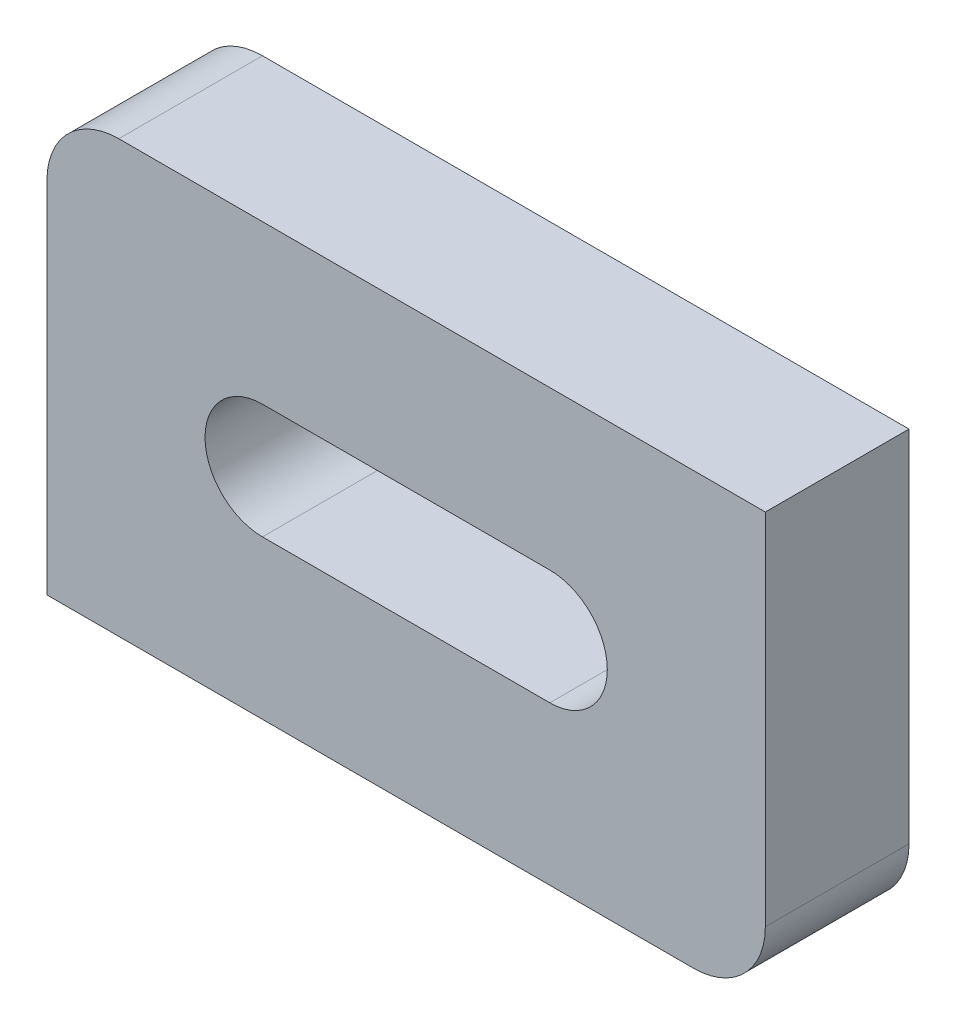
ISO-10303-21;
HEADER;
FILE_DESCRIPTION(('STEP AP214'),'2;1');
FILE_NAME('part.step','',(''),(''),'','','');
FILE_SCHEMA(('AUTOMOTIVE_DESIGN { 1 0 10303 214 1 1 1 1 }'));
ENDSEC;
DATA;
#1=APPLICATION_CONTEXT('core data for automotive mechanical design processes');
#2=APPLICATION_PROTOCOL_DEFINITION('international standard','automotive_design',2000,#1);
#3=PRODUCT_CONTEXT('',#1,'mechanical');
#4=PRODUCT('Part','Part','',(#3));
#5=PRODUCT_RELATED_PRODUCT_CATEGORY('part','',(#4));
#6=PRODUCT_DEFINITION_FORMATION('','',#4);
#7=PRODUCT_DEFINITION_CONTEXT('part definition',#1,'design');
#8=PRODUCT_DEFINITION('design','',#6,#7);
#9=PRODUCT_DEFINITION_SHAPE('','',#8);
#10=(LENGTH_UNIT() NAMED_UNIT(*) SI_UNIT(.MILLI.,.METRE.));
#11=(NAMED_UNIT(*) PLANE_ANGLE_UNIT() SI_UNIT($,.RADIAN.));
#12=(NAMED_UNIT(*) SI_UNIT($,.STERADIAN.) SOLID_ANGLE_UNIT());
#13=UNCERTAINTY_MEASURE_WITH_UNIT(LENGTH_MEASURE(1.E-05),#10,'distance_accuracy_value','');
#14=(GEOMETRIC_REPRESENTATION_CONTEXT(3) GLOBAL_UNCERTAINTY_ASSIGNED_CONTEXT((#13)) GLOBAL_UNIT_ASSIGNED_CONTEXT((#10,
#11,#12)) REPRESENTATION_CONTEXT('',''));
#15=CARTESIAN_POINT('',(0.,0.,0.));
#16=DIRECTION('',(0.,0.,1.));
#17=DIRECTION('',(1.,0.,0.));
#18=AXIS2_PLACEMENT_3D('',#15,#16,#17);
#19=CARTESIAN_POINT('',(45.,5.,10.));
#20=DIRECTION('',(0.,0.,-1.));
#21=DIRECTION('',(-1.,0.,0.));
#22=AXIS2_PLACEMENT_3D('',#19,#20,#21);
#23=PLANE('',#22);
#24=DIRECTION('',(0.,-1.,0.));
#25=VECTOR('',#24,1.);
#26=CARTESIAN_POINT('',(0.,25.,10.));
#27=LINE('',#26,#25);
#28=CARTESIAN_POINT('',(0.,25.,10.));
#29=VERTEX_POINT('',#28);
#30=CARTESIAN_POINT('',(0.,0.,10.));
#31=VERTEX_POINT('',#30);
#32=EDGE_CURVE('E148',#29,#31,#27,.T.);
#33=ORIENTED_EDGE('',*,*,#32,.T.);
#34=DIRECTION('',(1.,0.,0.));
#35=VECTOR('',#34,1.);
#36=CARTESIAN_POINT('',(0.,0.,10.));
#37=LINE('',#36,#35);
#38=CARTESIAN_POINT('',(45.,0.,10.));
#39=VERTEX_POINT('',#38);
#40=EDGE_CURVE('E151',#31,#39,#37,.T.);
#41=ORIENTED_EDGE('',*,*,#40,.T.);
#42=CARTESIAN_POINT('',(45.,5.,10.));
#43=DIRECTION('',(0.,0.,1.));
#44=DIRECTION('',(-1.,0.,0.));
#45=AXIS2_PLACEMENT_3D('',#42,#43,#44);
#46=CIRCLE('',#45,5.);
#47=CARTESIAN_POINT('',(50.,5.00000000000004,10.));
#48=VERTEX_POINT('',#47);
#49=EDGE_CURVE('E154',#39,#48,#46,.T.);
#50=ORIENTED_EDGE('',*,*,#49,.T.);
#51=DIRECTION('',(0.,1.,0.));
#52=VECTOR('',#51,1.);
#53=CARTESIAN_POINT('',(50.,5.00000000000004,10.));
#54=LINE('',#53,#52);
#55=CARTESIAN_POINT('',(50.,30.,10.));
#56=VERTEX_POINT('',#55);
#57=EDGE_CURVE('E156',#48,#56,#54,.T.);
#58=ORIENTED_EDGE('',*,*,#57,.T.);
#59=DIRECTION('',(-1.,0.,0.));
#60=VECTOR('',#59,1.);
#61=CARTESIAN_POINT('',(50.,30.,10.));
#62=LINE('',#61,#60);
#63=CARTESIAN_POINT('',(5.00000000000004,30.,10.));
#64=VERTEX_POINT('',#63);
#65=EDGE_CURVE('E158',#56,#64,#62,.T.);
#66=ORIENTED_EDGE('',*,*,#65,.T.);
#67=CARTESIAN_POINT('',(5.,25.,10.));
#68=DIRECTION('',(0.,0.,1.));
#69=DIRECTION('',(-1.,0.,0.));
#70=AXIS2_PLACEMENT_3D('',#67,#68,#69);
#71=CIRCLE('',#70,5.);
#72=EDGE_CURVE('E160',#64,#29,#71,.T.);
#73=ORIENTED_EDGE('',*,*,#72,.T.);
#74=EDGE_LOOP('',(#33,#41,#50,#58,#66,#73));
#75=FACE_BOUND('',#74,.T.);
#76=CARTESIAN_POINT('',(15.,15.,10.));
#77=DIRECTION('',(0.,0.,1.));
#78=DIRECTION('',(1.,0.,0.));
#79=AXIS2_PLACEMENT_3D('',#76,#77,#78);
#80=CIRCLE('',#79,4.);
#81=CARTESIAN_POINT('',(15.,19.,10.));
#82=VERTEX_POINT('',#81);
#83=CARTESIAN_POINT('',(15.,11.,10.));
#84=VERTEX_POINT('',#83);
#85=EDGE_CURVE('E112',#82,#84,#80,.T.);
#86=ORIENTED_EDGE('',*,*,#85,.F.);
#87=DIRECTION('',(-1.,0.,0.));
#88=VECTOR('',#87,1.);
#89=CARTESIAN_POINT('',(15.,19.,10.));
#90=LINE('',#89,#88);
#91=CARTESIAN_POINT('',(35.,19.,10.));
#92=VERTEX_POINT('',#91);
#93=EDGE_CURVE('E134',#92,#82,#90,.T.);
#94=ORIENTED_EDGE('',*,*,#93,.F.);
#95=CARTESIAN_POINT('',(35.,15.,10.));
#96=DIRECTION('',(0.,0.,1.));
#97=DIRECTION('',(1.,0.,0.));
#98=AXIS2_PLACEMENT_3D('',#95,#96,#97);
#99=CIRCLE('',#98,4.);
#100=CARTESIAN_POINT('',(35.,11.,10.));
#101=VERTEX_POINT('',#100);
#102=EDGE_CURVE('E132',#101,#92,#99,.T.);
#103=ORIENTED_EDGE('',*,*,#102,.F.);
#104=DIRECTION('',(1.,0.,0.));
#105=VECTOR('',#104,1.);
#106=CARTESIAN_POINT('',(15.,11.,10.));
#107=LINE('',#106,#105);
#108=EDGE_CURVE('E120',#84,#101,#107,.T.);
#109=ORIENTED_EDGE('',*,*,#108,.F.);
#110=EDGE_LOOP('',(#86,#94,#103,#109));
#111=FACE_BOUND('',#110,.T.);
#112=ADVANCED_FACE('F35',(#75,#111),#23,.F.);
#113=CARTESIAN_POINT('',(45.,5.,0.));
#114=DIRECTION('',(0.,0.,-1.));
#115=DIRECTION('',(-1.,0.,0.));
#116=AXIS2_PLACEMENT_3D('',#113,#114,#115);
#117=PLANE('',#116);
#118=DIRECTION('',(0.,-1.,0.));
#119=VECTOR('',#118,1.);
#120=CARTESIAN_POINT('',(0.,25.,0.));
#121=LINE('',#120,#119);
#122=CARTESIAN_POINT('',(0.,25.,0.));
#123=VERTEX_POINT('',#122);
#124=CARTESIAN_POINT('',(0.,0.,0.));
#125=VERTEX_POINT('',#124);
#126=EDGE_CURVE('E128',#123,#125,#121,.T.);
#127=ORIENTED_EDGE('',*,*,#126,.F.);
#128=CARTESIAN_POINT('',(5.,25.,0.));
#129=DIRECTION('',(0.,0.,1.));
#130=DIRECTION('',(-1.,0.,0.));
#131=AXIS2_PLACEMENT_3D('',#128,#129,#130);
#132=CIRCLE('',#131,5.);
#133=CARTESIAN_POINT('',(5.00000000000004,30.,0.));
#134=VERTEX_POINT('',#133);
#135=EDGE_CURVE('E152',#134,#123,#132,.T.);
#136=ORIENTED_EDGE('',*,*,#135,.F.);
#137=DIRECTION('',(-1.,0.,0.));
#138=VECTOR('',#137,1.);
#139=CARTESIAN_POINT('',(50.,30.,0.));
#140=LINE('',#139,#138);
#141=CARTESIAN_POINT('',(50.,30.,0.));
#142=VERTEX_POINT('',#141);
#143=EDGE_CURVE('E171',#142,#134,#140,.T.);
#144=ORIENTED_EDGE('',*,*,#143,.F.);
#145=DIRECTION('',(0.,1.,0.));
#146=VECTOR('',#145,1.);
#147=CARTESIAN_POINT('',(50.,5.00000000000004,0.));
#148=LINE('',#147,#146);
#149=CARTESIAN_POINT('',(50.,5.00000000000004,0.));
#150=VERTEX_POINT('',#149);
#151=EDGE_CURVE('E169',#150,#142,#148,.T.);
#152=ORIENTED_EDGE('',*,*,#151,.F.);
#153=CARTESIAN_POINT('',(45.,5.,0.));
#154=DIRECTION('',(0.,0.,1.));
#155=DIRECTION('',(-1.,0.,0.));
#156=AXIS2_PLACEMENT_3D('',#153,#154,#155);
#157=CIRCLE('',#156,5.);
#158=CARTESIAN_POINT('',(45.,0.,0.));
#159=VERTEX_POINT('',#158);
#160=EDGE_CURVE('E167',#159,#150,#157,.T.);
#161=ORIENTED_EDGE('',*,*,#160,.F.);
#162=DIRECTION('',(1.,0.,0.));
#163=VECTOR('',#162,1.);
#164=CARTESIAN_POINT('',(0.,0.,0.));
#165=LINE('',#164,#163);
#166=EDGE_CURVE('E165',#125,#159,#165,.T.);
#167=ORIENTED_EDGE('',*,*,#166,.F.);
#168=EDGE_LOOP('',(#127,#136,#144,#152,#161,#167));
#169=FACE_BOUND('',#168,.T.);
#170=DIRECTION('',(-1.,0.,0.));
#171=VECTOR('',#170,1.);
#172=CARTESIAN_POINT('',(15.,19.,0.));
#173=LINE('',#172,#171);
#174=CARTESIAN_POINT('',(35.,19.,0.));
#175=VERTEX_POINT('',#174);
#176=CARTESIAN_POINT('',(15.,19.,0.));
#177=VERTEX_POINT('',#176);
#178=EDGE_CURVE('E121',#175,#177,#173,.T.);
#179=ORIENTED_EDGE('',*,*,#178,.T.);
#180=CARTESIAN_POINT('',(15.,15.,0.));
#181=DIRECTION('',(0.,0.,1.));
#182=DIRECTION('',(1.,0.,0.));
#183=AXIS2_PLACEMENT_3D('',#180,#181,#182);
#184=CIRCLE('',#183,4.);
#185=CARTESIAN_POINT('',(15.,11.,0.));
#186=VERTEX_POINT('',#185);
#187=EDGE_CURVE('E58',#177,#186,#184,.T.);
#188=ORIENTED_EDGE('',*,*,#187,.T.);
#189=DIRECTION('',(1.,0.,0.));
#190=VECTOR('',#189,1.);
#191=CARTESIAN_POINT('',(15.,11.,0.));
#192=LINE('',#191,#190);
#193=CARTESIAN_POINT('',(35.,11.,0.));
#194=VERTEX_POINT('',#193);
#195=EDGE_CURVE('E127',#186,#194,#192,.T.);
#196=ORIENTED_EDGE('',*,*,#195,.T.);
#197=CARTESIAN_POINT('',(35.,15.,0.));
#198=DIRECTION('',(0.,0.,1.));
#199=DIRECTION('',(1.,0.,0.));
#200=AXIS2_PLACEMENT_3D('',#197,#198,#199);
#201=CIRCLE('',#200,4.);
#202=EDGE_CURVE('E140',#194,#175,#201,.T.);
#203=ORIENTED_EDGE('',*,*,#202,.T.);
#204=EDGE_LOOP('',(#179,#188,#196,#203));
#205=FACE_BOUND('',#204,.T.);
#206=ADVANCED_FACE('F195',(#169,#205),#117,.T.);
#207=CARTESIAN_POINT('',(0.,25.,10.));
#208=DIRECTION('',(1.,0.,0.));
#209=DIRECTION('',(0.,0.,-1.));
#210=AXIS2_PLACEMENT_3D('',#207,#208,#209);
#211=PLANE('',#210);
#212=ORIENTED_EDGE('',*,*,#126,.T.);
#213=DIRECTION('',(0.,0.,-1.));
#214=VECTOR('',#213,1.);
#215=CARTESIAN_POINT('',(0.,0.,10.));
#216=LINE('',#215,#214);
#217=EDGE_CURVE('E11',#31,#125,#216,.T.);
#218=ORIENTED_EDGE('',*,*,#217,.F.);
#219=ORIENTED_EDGE('',*,*,#32,.F.);
#220=DIRECTION('',(0.,0.,-1.));
#221=VECTOR('',#220,1.);
#222=CARTESIAN_POINT('',(0.,25.,10.));
#223=LINE('',#222,#221);
#224=EDGE_CURVE('E162',#29,#123,#223,.T.);
#225=ORIENTED_EDGE('',*,*,#224,.T.);
#226=EDGE_LOOP('',(#212,#218,#219,#225));
#227=FACE_BOUND('',#226,.T.);
#228=ADVANCED_FACE('F37',(#227),#211,.F.);
#229=CARTESIAN_POINT('',(0.,0.,10.));
#230=DIRECTION('',(0.,1.,0.));
#231=DIRECTION('',(0.,0.,1.));
#232=AXIS2_PLACEMENT_3D('',#229,#230,#231);
#233=PLANE('',#232);
#234=ORIENTED_EDGE('',*,*,#166,.T.);
#235=DIRECTION('',(0.,0.,-1.));
#236=VECTOR('',#235,1.);
#237=CARTESIAN_POINT('',(45.,0.,10.));
#238=LINE('',#237,#236);
#239=EDGE_CURVE('E43',#39,#159,#238,.T.);
#240=ORIENTED_EDGE('',*,*,#239,.F.);
#241=ORIENTED_EDGE('',*,*,#40,.F.);
#242=ORIENTED_EDGE('',*,*,#217,.T.);
#243=EDGE_LOOP('',(#234,#240,#241,#242));
#244=FACE_BOUND('',#243,.T.);
#245=ADVANCED_FACE('F212',(#244),#233,.F.);
#246=CARTESIAN_POINT('',(45.,5.,10.));
#247=DIRECTION('',(0.,0.,-1.));
#248=DIRECTION('',(-1.,0.,0.));
#249=AXIS2_PLACEMENT_3D('',#246,#247,#248);
#250=CYLINDRICAL_SURFACE('',#249,5.);
#251=ORIENTED_EDGE('',*,*,#160,.T.);
#252=DIRECTION('',(0.,0.,-1.));
#253=VECTOR('',#252,1.);
#254=CARTESIAN_POINT('',(50.,5.00000000000004,10.));
#255=LINE('',#254,#253);
#256=EDGE_CURVE('E182',#48,#150,#255,.T.);
#257=ORIENTED_EDGE('',*,*,#256,.F.);
#258=ORIENTED_EDGE('',*,*,#49,.F.);
#259=ORIENTED_EDGE('',*,*,#239,.T.);
#260=EDGE_LOOP('',(#251,#257,#258,#259));
#261=FACE_BOUND('',#260,.T.);
#262=ADVANCED_FACE('F189',(#261),#250,.T.);
#263=CARTESIAN_POINT('',(50.,5.00000000000004,10.));
#264=DIRECTION('',(-1.,0.,0.));
#265=DIRECTION('',(0.,0.,1.));
#266=AXIS2_PLACEMENT_3D('',#263,#264,#265);
#267=PLANE('',#266);
#268=ORIENTED_EDGE('',*,*,#151,.T.);
#269=DIRECTION('',(0.,0.,-1.));
#270=VECTOR('',#269,1.);
#271=CARTESIAN_POINT('',(50.,30.,10.));
#272=LINE('',#271,#270);
#273=EDGE_CURVE('E179',#56,#142,#272,.T.);
#274=ORIENTED_EDGE('',*,*,#273,.F.);
#275=ORIENTED_EDGE('',*,*,#57,.F.);
#276=ORIENTED_EDGE('',*,*,#256,.T.);
#277=EDGE_LOOP('',(#268,#274,#275,#276));
#278=FACE_BOUND('',#277,.T.);
#279=ADVANCED_FACE('F201',(#278),#267,.F.);
#280=CARTESIAN_POINT('',(50.,30.,10.));
#281=DIRECTION('',(0.,-1.,0.));
#282=DIRECTION('',(0.,0.,-1.));
#283=AXIS2_PLACEMENT_3D('',#280,#281,#282);
#284=PLANE('',#283);
#285=ORIENTED_EDGE('',*,*,#143,.T.);
#286=DIRECTION('',(0.,0.,-1.));
#287=VECTOR('',#286,1.);
#288=CARTESIAN_POINT('',(5.00000000000004,30.,10.));
#289=LINE('',#288,#287);
#290=EDGE_CURVE('E176',#64,#134,#289,.T.);
#291=ORIENTED_EDGE('',*,*,#290,.F.);
#292=ORIENTED_EDGE('',*,*,#65,.F.);
#293=ORIENTED_EDGE('',*,*,#273,.T.);
#294=EDGE_LOOP('',(#285,#291,#292,#293));
#295=FACE_BOUND('',#294,.T.);
#296=ADVANCED_FACE('F205',(#295),#284,.F.);
#297=CARTESIAN_POINT('',(5.,25.,10.));
#298=DIRECTION('',(0.,0.,-1.));
#299=DIRECTION('',(-1.,0.,0.));
#300=AXIS2_PLACEMENT_3D('',#297,#298,#299);
#301=CYLINDRICAL_SURFACE('',#300,5.);
#302=ORIENTED_EDGE('',*,*,#135,.T.);
#303=ORIENTED_EDGE('',*,*,#224,.F.);
#304=ORIENTED_EDGE('',*,*,#72,.F.);
#305=ORIENTED_EDGE('',*,*,#290,.T.);
#306=EDGE_LOOP('',(#302,#303,#304,#305));
#307=FACE_BOUND('',#306,.T.);
#308=ADVANCED_FACE('F215',(#307),#301,.T.);
#309=CARTESIAN_POINT('',(15.,15.,10.));
#310=DIRECTION('',(0.,0.,-1.));
#311=DIRECTION('',(-1.,0.,0.));
#312=AXIS2_PLACEMENT_3D('',#309,#310,#311);
#313=CYLINDRICAL_SURFACE('',#312,4.);
#314=ORIENTED_EDGE('',*,*,#187,.F.);
#315=DIRECTION('',(0.,0.,-1.));
#316=VECTOR('',#315,1.);
#317=CARTESIAN_POINT('',(15.,19.,10.));
#318=LINE('',#317,#316);
#319=EDGE_CURVE('E116',#82,#177,#318,.T.);
#320=ORIENTED_EDGE('',*,*,#319,.F.);
#321=ORIENTED_EDGE('',*,*,#85,.T.);
#322=DIRECTION('',(0.,0.,-1.));
#323=VECTOR('',#322,1.);
#324=CARTESIAN_POINT('',(15.,11.,10.));
#325=LINE('',#324,#323);
#326=EDGE_CURVE('E115',#84,#186,#325,.T.);
#327=ORIENTED_EDGE('',*,*,#326,.T.);
#328=EDGE_LOOP('',(#314,#320,#321,#327));
#329=FACE_BOUND('',#328,.T.);
#330=ADVANCED_FACE('F114',(#329),#313,.F.);
#331=CARTESIAN_POINT('',(15.,11.,10.));
#332=DIRECTION('',(0.,1.,0.));
#333=DIRECTION('',(0.,0.,1.));
#334=AXIS2_PLACEMENT_3D('',#331,#332,#333);
#335=PLANE('',#334);
#336=ORIENTED_EDGE('',*,*,#195,.F.);
#337=ORIENTED_EDGE('',*,*,#326,.F.);
#338=ORIENTED_EDGE('',*,*,#108,.T.);
#339=DIRECTION('',(0.,0.,-1.));
#340=VECTOR('',#339,1.);
#341=CARTESIAN_POINT('',(35.,11.,10.));
#342=LINE('',#341,#340);
#343=EDGE_CURVE('E129',#101,#194,#342,.T.);
#344=ORIENTED_EDGE('',*,*,#343,.T.);
#345=EDGE_LOOP('',(#336,#337,#338,#344));
#346=FACE_BOUND('',#345,.T.);
#347=ADVANCED_FACE('F124',(#346),#335,.T.);
#348=CARTESIAN_POINT('',(35.,15.,10.));
#349=DIRECTION('',(0.,0.,-1.));
#350=DIRECTION('',(-1.,0.,0.));
#351=AXIS2_PLACEMENT_3D('',#348,#349,#350);
#352=CYLINDRICAL_SURFACE('',#351,4.);
#353=ORIENTED_EDGE('',*,*,#202,.F.);
#354=ORIENTED_EDGE('',*,*,#343,.F.);
#355=ORIENTED_EDGE('',*,*,#102,.T.);
#356=DIRECTION('',(0.,0.,-1.));
#357=VECTOR('',#356,1.);
#358=CARTESIAN_POINT('',(35.,19.,10.));
#359=LINE('',#358,#357);
#360=EDGE_CURVE('E50',#92,#175,#359,.T.);
#361=ORIENTED_EDGE('',*,*,#360,.T.);
#362=EDGE_LOOP('',(#353,#354,#355,#361));
#363=FACE_BOUND('',#362,.T.);
#364=ADVANCED_FACE('F233',(#363),#352,.F.);
#365=CARTESIAN_POINT('',(15.,19.,10.));
#366=DIRECTION('',(0.,-1.,0.));
#367=DIRECTION('',(0.,0.,-1.));
#368=AXIS2_PLACEMENT_3D('',#365,#366,#367);
#369=PLANE('',#368);
#370=ORIENTED_EDGE('',*,*,#178,.F.);
#371=ORIENTED_EDGE('',*,*,#360,.F.);
#372=ORIENTED_EDGE('',*,*,#93,.T.);
#373=ORIENTED_EDGE('',*,*,#319,.T.);
#374=EDGE_LOOP('',(#370,#371,#372,#373));
#375=FACE_BOUND('',#374,.T.);
#376=ADVANCED_FACE('F236',(#375),#369,.T.);
#377=CLOSED_SHELL('',(#112,#206,#228,#245,#262,#279,#296,#308,#330,#347,#364,#376));
#378=MANIFOLD_SOLID_BREP('B2',#377);
#379=ADVANCED_BREP_SHAPE_REPRESENTATION('',(#18,#378),#14);
#380=SHAPE_DEFINITION_REPRESENTATION(#9,#379);
ENDSEC;
END-ISO-10303-21;
